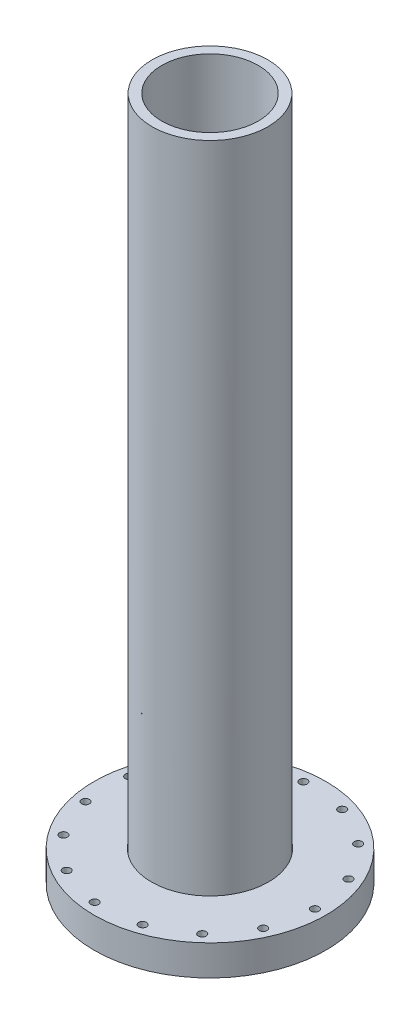
ISO-10303-21;
HEADER;
FILE_DESCRIPTION(('STEP AP214'),'2;1');
FILE_NAME('part.step','',(''),(''),'','','');
FILE_SCHEMA(('AUTOMOTIVE_DESIGN { 1 0 10303 214 1 1 1 1 }'));
ENDSEC;
DATA;
#1=APPLICATION_CONTEXT('core data for automotive mechanical design processes');
#2=APPLICATION_PROTOCOL_DEFINITION('international standard','automotive_design',2000,#1);
#3=PRODUCT_CONTEXT('',#1,'mechanical');
#4=PRODUCT('Part','Part','',(#3));
#5=PRODUCT_RELATED_PRODUCT_CATEGORY('part','',(#4));
#6=PRODUCT_DEFINITION_FORMATION('','',#4);
#7=PRODUCT_DEFINITION_CONTEXT('part definition',#1,'design');
#8=PRODUCT_DEFINITION('design','',#6,#7);
#9=PRODUCT_DEFINITION_SHAPE('','',#8);
#10=(LENGTH_UNIT() NAMED_UNIT(*) SI_UNIT(.MILLI.,.METRE.));
#11=(NAMED_UNIT(*) PLANE_ANGLE_UNIT() SI_UNIT($,.RADIAN.));
#12=(NAMED_UNIT(*) SI_UNIT($,.STERADIAN.) SOLID_ANGLE_UNIT());
#13=UNCERTAINTY_MEASURE_WITH_UNIT(LENGTH_MEASURE(1.E-05),#10,'distance_accuracy_value','');
#14=(GEOMETRIC_REPRESENTATION_CONTEXT(3) GLOBAL_UNCERTAINTY_ASSIGNED_CONTEXT((#13)) GLOBAL_UNIT_ASSIGNED_CONTEXT((#10,
#11,#12)) REPRESENTATION_CONTEXT('',''));
#15=CARTESIAN_POINT('',(0.,0.,0.));
#16=DIRECTION('',(0.,0.,1.));
#17=DIRECTION('',(1.,0.,0.));
#18=AXIS2_PLACEMENT_3D('',#15,#16,#17);
#19=CARTESIAN_POINT('',(0.,20.,0.));
#20=DIRECTION('',(0.,-1.,0.));
#21=DIRECTION('',(0.,0.,-1.));
#22=AXIS2_PLACEMENT_3D('',#19,#20,#21);
#23=CYLINDRICAL_SURFACE('',#22,38.4556);
#24=CARTESIAN_POINT('',(0.,20.,0.));
#25=DIRECTION('',(0.,1.,0.));
#26=DIRECTION('',(0.,0.,1.));
#27=AXIS2_PLACEMENT_3D('',#24,#25,#26);
#28=CIRCLE('',#27,38.4556);
#29=CARTESIAN_POINT('',(0.,20.,38.4556));
#30=VERTEX_POINT('',#29);
#31=EDGE_CURVE('E60',#30,#30,#28,.T.);
#32=ORIENTED_EDGE('',*,*,#31,.T.);
#33=EDGE_LOOP('',(#32));
#34=FACE_BOUND('',#33,.T.);
#35=CARTESIAN_POINT('',(0.,2.,0.));
#36=DIRECTION('',(0.,-1.,0.));
#37=DIRECTION('',(0.,0.,-1.));
#38=AXIS2_PLACEMENT_3D('',#35,#36,#37);
#39=CIRCLE('',#38,38.4556);
#40=CARTESIAN_POINT('',(0.,2.,-38.4556));
#41=VERTEX_POINT('',#40);
#42=EDGE_CURVE('E51',#41,#41,#39,.T.);
#43=ORIENTED_EDGE('',*,*,#42,.T.);
#44=EDGE_LOOP('',(#43));
#45=FACE_BOUND('',#44,.T.);
#46=ADVANCED_FACE('F47',(#34,#45),#23,.F.);
#47=CARTESIAN_POINT('',(0.,20.,0.));
#48=DIRECTION('',(0.,1.,0.));
#49=DIRECTION('',(0.,0.,1.));
#50=AXIS2_PLACEMENT_3D('',#47,#48,#49);
#51=PLANE('',#50);
#52=CARTESIAN_POINT('',(63.0346365773398,20.,-28.0648283722294));
#53=DIRECTION('',(0.,-1.,0.));
#54=DIRECTION('',(0.,0.,-1.));
#55=AXIS2_PLACEMENT_3D('',#52,#53,#54);
#56=CIRCLE('',#55,2.57975099999994);
#57=CARTESIAN_POINT('',(63.0346365773398,20.,-30.6445793722294));
#58=VERTEX_POINT('',#57);
#59=EDGE_CURVE('E148',#58,#58,#56,.T.);
#60=ORIENTED_EDGE('',*,*,#59,.T.);
#61=EDGE_LOOP('',(#60));
#62=FACE_BOUND('',#61,.T.);
#63=CARTESIAN_POINT('',(21.3221726118721,20.,-65.6228996243654));
#64=DIRECTION('',(0.,-1.,0.));
#65=DIRECTION('',(0.,0.,-1.));
#66=AXIS2_PLACEMENT_3D('',#63,#64,#65);
#67=CIRCLE('',#66,2.57975099999994);
#68=CARTESIAN_POINT('',(21.3221726118721,20.,-68.2026506243653));
#69=VERTEX_POINT('',#68);
#70=EDGE_CURVE('E136',#69,#69,#67,.T.);
#71=ORIENTED_EDGE('',*,*,#70,.T.);
#72=EDGE_LOOP('',(#71));
#73=FACE_BOUND('',#72,.T.);
#74=CARTESIAN_POINT('',(-34.4999999999994,20.,-59.7557528611266));
#75=DIRECTION('',(0.,-1.,0.));
#76=DIRECTION('',(0.,0.,-1.));
#77=AXIS2_PLACEMENT_3D('',#74,#75,#76);
#78=CIRCLE('',#77,2.57975099999994);
#79=CARTESIAN_POINT('',(-34.4999999999994,20.,-62.3355038611265));
#80=VERTEX_POINT('',#79);
#81=EDGE_CURVE('E124',#80,#80,#78,.T.);
#82=ORIENTED_EDGE('',*,*,#81,.T.);
#83=EDGE_LOOP('',(#82));
#84=FACE_BOUND('',#83,.T.);
#85=ORIENTED_EDGE('',*,*,#31,.F.);
#86=EDGE_LOOP('',(#85));
#87=FACE_BOUND('',#86,.T.);
#88=CARTESIAN_POINT('',(0.,20.,0.));
#89=DIRECTION('',(0.,1.,0.));
#90=DIRECTION('',(0.,0.,1.));
#91=AXIS2_PLACEMENT_3D('',#88,#89,#90);
#92=CIRCLE('',#91,76.2);
#93=CARTESIAN_POINT('',(0.,20.,76.2));
#94=VERTEX_POINT('',#93);
#95=EDGE_CURVE('E11',#94,#94,#92,.T.);
#96=ORIENTED_EDGE('',*,*,#95,.T.);
#97=EDGE_LOOP('',(#96));
#98=FACE_BOUND('',#97,.T.);
#99=CARTESIAN_POINT('',(69.,20.,0.));
#100=DIRECTION('',(0.,1.,0.));
#101=DIRECTION('',(0.,0.,1.));
#102=AXIS2_PLACEMENT_3D('',#99,#100,#101);
#103=CIRCLE('',#102,2.57975099999996);
#104=CARTESIAN_POINT('',(69.,20.,2.57975099999996));
#105=VERTEX_POINT('',#104);
#106=EDGE_CURVE('E64',#105,#105,#103,.T.);
#107=ORIENTED_EDGE('',*,*,#106,.F.);
#108=EDGE_LOOP('',(#107));
#109=FACE_BOUND('',#108,.T.);
#110=CARTESIAN_POINT('',(63.0346365773394,20.,28.0648283722303));
#111=DIRECTION('',(0.,-1.,0.));
#112=DIRECTION('',(0.,0.,-1.));
#113=AXIS2_PLACEMENT_3D('',#110,#111,#112);
#114=CIRCLE('',#113,2.57975099999994);
#115=CARTESIAN_POINT('',(63.0346365773394,20.,25.4850773722303));
#116=VERTEX_POINT('',#115);
#117=EDGE_CURVE('E70',#116,#116,#114,.T.);
#118=ORIENTED_EDGE('',*,*,#117,.T.);
#119=EDGE_LOOP('',(#118));
#120=FACE_BOUND('',#119,.T.);
#121=CARTESIAN_POINT('',(46.1700118387611,20.,51.2769929579403));
#122=DIRECTION('',(0.,-1.,0.));
#123=DIRECTION('',(0.,0.,-1.));
#124=AXIS2_PLACEMENT_3D('',#121,#122,#123);
#125=CIRCLE('',#124,2.57975099999994);
#126=CARTESIAN_POINT('',(46.1700118387611,20.,48.6972419579403));
#127=VERTEX_POINT('',#126);
#128=EDGE_CURVE('E76',#127,#127,#125,.T.);
#129=ORIENTED_EDGE('',*,*,#128,.T.);
#130=EDGE_LOOP('',(#129));
#131=FACE_BOUND('',#130,.T.);
#132=CARTESIAN_POINT('',(21.3221726118712,20.,65.6228996243657));
#133=DIRECTION('',(0.,-1.,0.));
#134=DIRECTION('',(0.,0.,-1.));
#135=AXIS2_PLACEMENT_3D('',#132,#133,#134);
#136=CIRCLE('',#135,2.57975099999994);
#137=CARTESIAN_POINT('',(21.3221726118712,20.,63.0431486243657));
#138=VERTEX_POINT('',#137);
#139=EDGE_CURVE('E82',#138,#138,#136,.T.);
#140=ORIENTED_EDGE('',*,*,#139,.T.);
#141=EDGE_LOOP('',(#140));
#142=FACE_BOUND('',#141,.T.);
#143=CARTESIAN_POINT('',(-7.21246396546834,20.,68.6220107804108));
#144=DIRECTION('',(0.,-1.,0.));
#145=DIRECTION('',(0.,0.,-1.));
#146=AXIS2_PLACEMENT_3D('',#143,#144,#145);
#147=CIRCLE('',#146,2.57975099999994);
#148=CARTESIAN_POINT('',(-7.21246396546834,20.,66.0422597804109));
#149=VERTEX_POINT('',#148);
#150=EDGE_CURVE('E88',#149,#149,#147,.T.);
#151=ORIENTED_EDGE('',*,*,#150,.T.);
#152=EDGE_LOOP('',(#151));
#153=FACE_BOUND('',#152,.T.);
#154=CARTESIAN_POINT('',(-34.5000000000003,20.,59.7557528611261));
#155=DIRECTION('',(0.,-1.,0.));
#156=DIRECTION('',(0.,0.,-1.));
#157=AXIS2_PLACEMENT_3D('',#154,#155,#156);
#158=CIRCLE('',#157,2.57975099999994);
#159=CARTESIAN_POINT('',(-34.5000000000003,20.,57.1760018611262));
#160=VERTEX_POINT('',#159);
#161=EDGE_CURVE('E94',#160,#160,#158,.T.);
#162=ORIENTED_EDGE('',*,*,#161,.T.);
#163=EDGE_LOOP('',(#162));
#164=FACE_BOUND('',#163,.T.);
#165=CARTESIAN_POINT('',(-55.8221726118716,20.,40.5571824081804));
#166=DIRECTION('',(0.,-1.,0.));
#167=DIRECTION('',(0.,0.,-1.));
#168=AXIS2_PLACEMENT_3D('',#165,#166,#167);
#169=CIRCLE('',#168,2.57975099999994);
#170=CARTESIAN_POINT('',(-55.8221726118716,20.,37.9774314081804));
#171=VERTEX_POINT('',#170);
#172=EDGE_CURVE('E100',#171,#171,#169,.T.);
#173=ORIENTED_EDGE('',*,*,#172,.T.);
#174=EDGE_LOOP('',(#173));
#175=FACE_BOUND('',#174,.T.);
#176=CARTESIAN_POINT('',(-67.4921844506327,20.,14.345906666425));
#177=DIRECTION('',(0.,-1.,0.));
#178=DIRECTION('',(0.,0.,-1.));
#179=AXIS2_PLACEMENT_3D('',#176,#177,#178);
#180=CIRCLE('',#179,2.57975099999994);
#181=CARTESIAN_POINT('',(-67.4921844506327,20.,11.766155666425));
#182=VERTEX_POINT('',#181);
#183=EDGE_CURVE('E106',#182,#182,#180,.T.);
#184=ORIENTED_EDGE('',*,*,#183,.T.);
#185=EDGE_LOOP('',(#184));
#186=FACE_BOUND('',#185,.T.);
#187=CARTESIAN_POINT('',(-67.4921844506325,20.,-14.3459066664259));
#188=DIRECTION('',(0.,-1.,0.));
#189=DIRECTION('',(0.,0.,-1.));
#190=AXIS2_PLACEMENT_3D('',#187,#188,#189);
#191=CIRCLE('',#190,2.57975099999994);
#192=CARTESIAN_POINT('',(-67.4921844506325,20.,-16.9256576664258));
#193=VERTEX_POINT('',#192);
#194=EDGE_CURVE('E112',#193,#193,#191,.T.);
#195=ORIENTED_EDGE('',*,*,#194,.T.);
#196=EDGE_LOOP('',(#195));
#197=FACE_BOUND('',#196,.T.);
#198=CARTESIAN_POINT('',(-55.822172611871,20.,-40.5571824081811));
#199=DIRECTION('',(0.,-1.,0.));
#200=DIRECTION('',(0.,0.,-1.));
#201=AXIS2_PLACEMENT_3D('',#198,#199,#200);
#202=CIRCLE('',#201,2.57975099999994);
#203=CARTESIAN_POINT('',(-55.822172611871,20.,-43.1369334081811));
#204=VERTEX_POINT('',#203);
#205=EDGE_CURVE('E118',#204,#204,#202,.T.);
#206=ORIENTED_EDGE('',*,*,#205,.T.);
#207=EDGE_LOOP('',(#206));
#208=FACE_BOUND('',#207,.T.);
#209=CARTESIAN_POINT('',(-7.21246396546741,20.,-68.6220107804109));
#210=DIRECTION('',(0.,-1.,0.));
#211=DIRECTION('',(0.,0.,-1.));
#212=AXIS2_PLACEMENT_3D('',#209,#210,#211);
#213=CIRCLE('',#212,2.57975099999994);
#214=CARTESIAN_POINT('',(-7.21246396546741,20.,-71.2017617804109));
#215=VERTEX_POINT('',#214);
#216=EDGE_CURVE('E130',#215,#215,#213,.T.);
#217=ORIENTED_EDGE('',*,*,#216,.T.);
#218=EDGE_LOOP('',(#217));
#219=FACE_BOUND('',#218,.T.);
#220=CARTESIAN_POINT('',(46.1700118387618,20.,-51.2769929579397));
#221=DIRECTION('',(0.,-1.,0.));
#222=DIRECTION('',(0.,0.,-1.));
#223=AXIS2_PLACEMENT_3D('',#220,#221,#222);
#224=CIRCLE('',#223,2.57975099999994);
#225=CARTESIAN_POINT('',(46.1700118387618,20.,-53.8567439579396));
#226=VERTEX_POINT('',#225);
#227=EDGE_CURVE('E142',#226,#226,#224,.T.);
#228=ORIENTED_EDGE('',*,*,#227,.T.);
#229=EDGE_LOOP('',(#228));
#230=FACE_BOUND('',#229,.T.);
#231=ADVANCED_FACE('F176',(#62,#73,#84,#87,#98,#109,#120,#131,#142,#153,#164,#175,#186,#197,
#208,#219,#230),#51,.T.);
#232=CARTESIAN_POINT('',(0.,0.,0.));
#233=DIRECTION('',(0.,1.,0.));
#234=DIRECTION('',(0.,0.,1.));
#235=AXIS2_PLACEMENT_3D('',#232,#233,#234);
#236=PLANE('',#235);
#237=CARTESIAN_POINT('',(0.,0.,0.));
#238=DIRECTION('',(0.,-1.,0.));
#239=DIRECTION('',(0.,0.,-1.));
#240=AXIS2_PLACEMENT_3D('',#237,#238,#239);
#241=CIRCLE('',#240,55.14);
#242=CARTESIAN_POINT('',(0.,0.,-55.14));
#243=VERTEX_POINT('',#242);
#244=EDGE_CURVE('E154',#243,#243,#241,.T.);
#245=ORIENTED_EDGE('',*,*,#244,.F.);
#246=EDGE_LOOP('',(#245));
#247=FACE_BOUND('',#246,.T.);
#248=CARTESIAN_POINT('',(63.0346365773398,0.,-28.0648283722294));
#249=DIRECTION('',(0.,-1.,0.));
#250=DIRECTION('',(0.,0.,-1.));
#251=AXIS2_PLACEMENT_3D('',#248,#249,#250);
#252=CIRCLE('',#251,2.57975099999999);
#253=CARTESIAN_POINT('',(63.0346365773398,0.,-30.6445793722294));
#254=VERTEX_POINT('',#253);
#255=EDGE_CURVE('E151',#254,#254,#252,.T.);
#256=ORIENTED_EDGE('',*,*,#255,.F.);
#257=EDGE_LOOP('',(#256));
#258=FACE_BOUND('',#257,.T.);
#259=CARTESIAN_POINT('',(21.3221726118721,0.,-65.6228996243654));
#260=DIRECTION('',(0.,-1.,0.));
#261=DIRECTION('',(0.,0.,-1.));
#262=AXIS2_PLACEMENT_3D('',#259,#260,#261);
#263=CIRCLE('',#262,2.57975099999999);
#264=CARTESIAN_POINT('',(21.3221726118721,0.,-68.2026506243654));
#265=VERTEX_POINT('',#264);
#266=EDGE_CURVE('E139',#265,#265,#263,.T.);
#267=ORIENTED_EDGE('',*,*,#266,.F.);
#268=EDGE_LOOP('',(#267));
#269=FACE_BOUND('',#268,.T.);
#270=CARTESIAN_POINT('',(-34.4999999999994,0.,-59.7557528611266));
#271=DIRECTION('',(0.,-1.,0.));
#272=DIRECTION('',(0.,0.,-1.));
#273=AXIS2_PLACEMENT_3D('',#270,#271,#272);
#274=CIRCLE('',#273,2.57975099999999);
#275=CARTESIAN_POINT('',(-34.4999999999994,0.,-62.3355038611266));
#276=VERTEX_POINT('',#275);
#277=EDGE_CURVE('E127',#276,#276,#274,.T.);
#278=ORIENTED_EDGE('',*,*,#277,.F.);
#279=EDGE_LOOP('',(#278));
#280=FACE_BOUND('',#279,.T.);
#281=CARTESIAN_POINT('',(-55.822172611871,0.,-40.5571824081811));
#282=DIRECTION('',(0.,-1.,0.));
#283=DIRECTION('',(0.,0.,-1.));
#284=AXIS2_PLACEMENT_3D('',#281,#282,#283);
#285=CIRCLE('',#284,2.57975099999999);
#286=CARTESIAN_POINT('',(-55.822172611871,0.,-43.1369334081811));
#287=VERTEX_POINT('',#286);
#288=EDGE_CURVE('E121',#287,#287,#285,.T.);
#289=ORIENTED_EDGE('',*,*,#288,.F.);
#290=EDGE_LOOP('',(#289));
#291=FACE_BOUND('',#290,.T.);
#292=CARTESIAN_POINT('',(-67.4921844506327,0.,14.345906666425));
#293=DIRECTION('',(0.,-1.,0.));
#294=DIRECTION('',(0.,0.,-1.));
#295=AXIS2_PLACEMENT_3D('',#292,#293,#294);
#296=CIRCLE('',#295,2.57975099999999);
#297=CARTESIAN_POINT('',(-67.4921844506327,0.,11.766155666425));
#298=VERTEX_POINT('',#297);
#299=EDGE_CURVE('E109',#298,#298,#296,.T.);
#300=ORIENTED_EDGE('',*,*,#299,.F.);
#301=EDGE_LOOP('',(#300));
#302=FACE_BOUND('',#301,.T.);
#303=CARTESIAN_POINT('',(-55.8221726118716,0.,40.5571824081804));
#304=DIRECTION('',(0.,-1.,0.));
#305=DIRECTION('',(0.,0.,-1.));
#306=AXIS2_PLACEMENT_3D('',#303,#304,#305);
#307=CIRCLE('',#306,2.57975099999999);
#308=CARTESIAN_POINT('',(-55.8221726118716,0.,37.9774314081804));
#309=VERTEX_POINT('',#308);
#310=EDGE_CURVE('E103',#309,#309,#307,.T.);
#311=ORIENTED_EDGE('',*,*,#310,.F.);
#312=EDGE_LOOP('',(#311));
#313=FACE_BOUND('',#312,.T.);
#314=CARTESIAN_POINT('',(-34.5000000000003,0.,59.7557528611261));
#315=DIRECTION('',(0.,-1.,0.));
#316=DIRECTION('',(0.,0.,-1.));
#317=AXIS2_PLACEMENT_3D('',#314,#315,#316);
#318=CIRCLE('',#317,2.57975099999998);
#319=CARTESIAN_POINT('',(-34.5000000000003,0.,57.1760018611261));
#320=VERTEX_POINT('',#319);
#321=EDGE_CURVE('E97',#320,#320,#318,.T.);
#322=ORIENTED_EDGE('',*,*,#321,.F.);
#323=EDGE_LOOP('',(#322));
#324=FACE_BOUND('',#323,.T.);
#325=CARTESIAN_POINT('',(21.3221726118712,0.,65.6228996243657));
#326=DIRECTION('',(0.,-1.,0.));
#327=DIRECTION('',(0.,0.,-1.));
#328=AXIS2_PLACEMENT_3D('',#325,#326,#327);
#329=CIRCLE('',#328,2.57975099999999);
#330=CARTESIAN_POINT('',(21.3221726118712,0.,63.0431486243657));
#331=VERTEX_POINT('',#330);
#332=EDGE_CURVE('E85',#331,#331,#329,.T.);
#333=ORIENTED_EDGE('',*,*,#332,.F.);
#334=EDGE_LOOP('',(#333));
#335=FACE_BOUND('',#334,.T.);
#336=CARTESIAN_POINT('',(46.1700118387611,0.,51.2769929579403));
#337=DIRECTION('',(0.,-1.,0.));
#338=DIRECTION('',(0.,0.,-1.));
#339=AXIS2_PLACEMENT_3D('',#336,#337,#338);
#340=CIRCLE('',#339,2.57975099999999);
#341=CARTESIAN_POINT('',(46.1700118387611,0.,48.6972419579403));
#342=VERTEX_POINT('',#341);
#343=EDGE_CURVE('E79',#342,#342,#340,.T.);
#344=ORIENTED_EDGE('',*,*,#343,.F.);
#345=EDGE_LOOP('',(#344));
#346=FACE_BOUND('',#345,.T.);
#347=CARTESIAN_POINT('',(63.0346365773394,0.,28.0648283722303));
#348=DIRECTION('',(0.,-1.,0.));
#349=DIRECTION('',(0.,0.,-1.));
#350=AXIS2_PLACEMENT_3D('',#347,#348,#349);
#351=CIRCLE('',#350,2.57975099999999);
#352=CARTESIAN_POINT('',(63.0346365773394,0.,25.4850773722303));
#353=VERTEX_POINT('',#352);
#354=EDGE_CURVE('E73',#353,#353,#351,.T.);
#355=ORIENTED_EDGE('',*,*,#354,.F.);
#356=EDGE_LOOP('',(#355));
#357=FACE_BOUND('',#356,.T.);
#358=CARTESIAN_POINT('',(69.,0.,0.));
#359=DIRECTION('',(0.,-1.,0.));
#360=DIRECTION('',(0.,0.,-1.));
#361=AXIS2_PLACEMENT_3D('',#358,#359,#360);
#362=CIRCLE('',#361,2.57975099999999);
#363=CARTESIAN_POINT('',(69.,0.,-2.57975099999999));
#364=VERTEX_POINT('',#363);
#365=EDGE_CURVE('E67',#364,#364,#362,.T.);
#366=ORIENTED_EDGE('',*,*,#365,.F.);
#367=EDGE_LOOP('',(#366));
#368=FACE_BOUND('',#367,.T.);
#369=CARTESIAN_POINT('',(0.,0.,0.));
#370=DIRECTION('',(0.,1.,0.));
#371=DIRECTION('',(0.,0.,1.));
#372=AXIS2_PLACEMENT_3D('',#369,#370,#371);
#373=CIRCLE('',#372,76.2);
#374=CARTESIAN_POINT('',(0.,0.,76.2));
#375=VERTEX_POINT('',#374);
#376=EDGE_CURVE('E55',#375,#375,#373,.T.);
#377=ORIENTED_EDGE('',*,*,#376,.F.);
#378=EDGE_LOOP('',(#377));
#379=FACE_BOUND('',#378,.T.);
#380=CARTESIAN_POINT('',(-7.21246396546834,0.,68.6220107804108));
#381=DIRECTION('',(0.,-1.,0.));
#382=DIRECTION('',(0.,0.,-1.));
#383=AXIS2_PLACEMENT_3D('',#380,#381,#382);
#384=CIRCLE('',#383,2.57975099999999);
#385=CARTESIAN_POINT('',(-7.21246396546834,0.,66.0422597804109));
#386=VERTEX_POINT('',#385);
#387=EDGE_CURVE('E91',#386,#386,#384,.T.);
#388=ORIENTED_EDGE('',*,*,#387,.F.);
#389=EDGE_LOOP('',(#388));
#390=FACE_BOUND('',#389,.T.);
#391=CARTESIAN_POINT('',(-67.4921844506325,0.,-14.3459066664259));
#392=DIRECTION('',(0.,-1.,0.));
#393=DIRECTION('',(0.,0.,-1.));
#394=AXIS2_PLACEMENT_3D('',#391,#392,#393);
#395=CIRCLE('',#394,2.57975099999999);
#396=CARTESIAN_POINT('',(-67.4921844506325,0.,-16.9256576664259));
#397=VERTEX_POINT('',#396);
#398=EDGE_CURVE('E115',#397,#397,#395,.T.);
#399=ORIENTED_EDGE('',*,*,#398,.F.);
#400=EDGE_LOOP('',(#399));
#401=FACE_BOUND('',#400,.T.);
#402=CARTESIAN_POINT('',(-7.21246396546741,0.,-68.6220107804109));
#403=DIRECTION('',(0.,-1.,0.));
#404=DIRECTION('',(0.,0.,-1.));
#405=AXIS2_PLACEMENT_3D('',#402,#403,#404);
#406=CIRCLE('',#405,2.57975099999999);
#407=CARTESIAN_POINT('',(-7.21246396546741,0.,-71.2017617804109));
#408=VERTEX_POINT('',#407);
#409=EDGE_CURVE('E133',#408,#408,#406,.T.);
#410=ORIENTED_EDGE('',*,*,#409,.F.);
#411=EDGE_LOOP('',(#410));
#412=FACE_BOUND('',#411,.T.);
#413=CARTESIAN_POINT('',(46.1700118387618,0.,-51.2769929579397));
#414=DIRECTION('',(0.,-1.,0.));
#415=DIRECTION('',(0.,0.,-1.));
#416=AXIS2_PLACEMENT_3D('',#413,#414,#415);
#417=CIRCLE('',#416,2.57975099999999);
#418=CARTESIAN_POINT('',(46.1700118387618,0.,-53.8567439579396));
#419=VERTEX_POINT('',#418);
#420=EDGE_CURVE('E145',#419,#419,#417,.T.);
#421=ORIENTED_EDGE('',*,*,#420,.F.);
#422=EDGE_LOOP('',(#421));
#423=FACE_BOUND('',#422,.T.);
#424=ADVANCED_FACE('F182',(#247,#258,#269,#280,#291,#302,#313,#324,#335,#346,#357,#368,#379,
#390,#401,#412,#423),#236,.F.);
#425=CARTESIAN_POINT('',(0.,20.,0.));
#426=DIRECTION('',(0.,-1.,0.));
#427=DIRECTION('',(0.,0.,-1.));
#428=AXIS2_PLACEMENT_3D('',#425,#426,#427);
#429=CYLINDRICAL_SURFACE('',#428,76.2);
#430=ORIENTED_EDGE('',*,*,#95,.F.);
#431=EDGE_LOOP('',(#430));
#432=FACE_BOUND('',#431,.T.);
#433=ORIENTED_EDGE('',*,*,#376,.T.);
#434=EDGE_LOOP('',(#433));
#435=FACE_BOUND('',#434,.T.);
#436=ADVANCED_FACE('F49',(#432,#435),#429,.T.);
#437=CARTESIAN_POINT('',(69.,0.,0.));
#438=DIRECTION('',(0.,-1.,0.));
#439=DIRECTION('',(0.,0.,-1.));
#440=AXIS2_PLACEMENT_3D('',#437,#438,#439);
#441=CYLINDRICAL_SURFACE('',#440,2.57975099999996);
#442=ORIENTED_EDGE('',*,*,#106,.T.);
#443=EDGE_LOOP('',(#442));
#444=FACE_BOUND('',#443,.T.);
#445=ORIENTED_EDGE('',*,*,#365,.T.);
#446=EDGE_LOOP('',(#445));
#447=FACE_BOUND('',#446,.T.);
#448=ADVANCED_FACE('F186',(#444,#447),#441,.F.);
#449=CARTESIAN_POINT('',(63.0346365773394,0.,28.0648283722303));
#450=DIRECTION('',(0.,-1.,0.));
#451=DIRECTION('',(0.,0.,-1.));
#452=AXIS2_PLACEMENT_3D('',#449,#450,#451);
#453=CYLINDRICAL_SURFACE('',#452,2.57975099999996);
#454=ORIENTED_EDGE('',*,*,#117,.F.);
#455=EDGE_LOOP('',(#454));
#456=FACE_BOUND('',#455,.T.);
#457=ORIENTED_EDGE('',*,*,#354,.T.);
#458=EDGE_LOOP('',(#457));
#459=FACE_BOUND('',#458,.T.);
#460=ADVANCED_FACE('F281',(#456,#459),#453,.F.);
#461=CARTESIAN_POINT('',(46.1700118387611,0.,51.2769929579403));
#462=DIRECTION('',(0.,-1.,0.));
#463=DIRECTION('',(0.,0.,-1.));
#464=AXIS2_PLACEMENT_3D('',#461,#462,#463);
#465=CYLINDRICAL_SURFACE('',#464,2.57975099999997);
#466=ORIENTED_EDGE('',*,*,#128,.F.);
#467=EDGE_LOOP('',(#466));
#468=FACE_BOUND('',#467,.T.);
#469=ORIENTED_EDGE('',*,*,#343,.T.);
#470=EDGE_LOOP('',(#469));
#471=FACE_BOUND('',#470,.T.);
#472=ADVANCED_FACE('F278',(#468,#471),#465,.F.);
#473=CARTESIAN_POINT('',(21.3221726118712,0.,65.6228996243657));
#474=DIRECTION('',(0.,-1.,0.));
#475=DIRECTION('',(0.,0.,-1.));
#476=AXIS2_PLACEMENT_3D('',#473,#474,#475);
#477=CYLINDRICAL_SURFACE('',#476,2.57975099999997);
#478=ORIENTED_EDGE('',*,*,#139,.F.);
#479=EDGE_LOOP('',(#478));
#480=FACE_BOUND('',#479,.T.);
#481=ORIENTED_EDGE('',*,*,#332,.T.);
#482=EDGE_LOOP('',(#481));
#483=FACE_BOUND('',#482,.T.);
#484=ADVANCED_FACE('F274',(#480,#483),#477,.F.);
#485=CARTESIAN_POINT('',(-7.21246396546834,0.,68.6220107804108));
#486=DIRECTION('',(0.,-1.,0.));
#487=DIRECTION('',(0.,0.,-1.));
#488=AXIS2_PLACEMENT_3D('',#485,#486,#487);
#489=CYLINDRICAL_SURFACE('',#488,2.57975099999996);
#490=ORIENTED_EDGE('',*,*,#150,.F.);
#491=EDGE_LOOP('',(#490));
#492=FACE_BOUND('',#491,.T.);
#493=ORIENTED_EDGE('',*,*,#387,.T.);
#494=EDGE_LOOP('',(#493));
#495=FACE_BOUND('',#494,.T.);
#496=ADVANCED_FACE('F270',(#492,#495),#489,.F.);
#497=CARTESIAN_POINT('',(-34.5000000000003,0.,59.7557528611261));
#498=DIRECTION('',(0.,-1.,0.));
#499=DIRECTION('',(0.,0.,-1.));
#500=AXIS2_PLACEMENT_3D('',#497,#498,#499);
#501=CYLINDRICAL_SURFACE('',#500,2.57975099999996);
#502=ORIENTED_EDGE('',*,*,#161,.F.);
#503=EDGE_LOOP('',(#502));
#504=FACE_BOUND('',#503,.T.);
#505=ORIENTED_EDGE('',*,*,#321,.T.);
#506=EDGE_LOOP('',(#505));
#507=FACE_BOUND('',#506,.T.);
#508=ADVANCED_FACE('F266',(#504,#507),#501,.F.);
#509=CARTESIAN_POINT('',(-55.8221726118716,0.,40.5571824081804));
#510=DIRECTION('',(0.,-1.,0.));
#511=DIRECTION('',(0.,0.,-1.));
#512=AXIS2_PLACEMENT_3D('',#509,#510,#511);
#513=CYLINDRICAL_SURFACE('',#512,2.57975099999997);
#514=ORIENTED_EDGE('',*,*,#172,.F.);
#515=EDGE_LOOP('',(#514));
#516=FACE_BOUND('',#515,.T.);
#517=ORIENTED_EDGE('',*,*,#310,.T.);
#518=EDGE_LOOP('',(#517));
#519=FACE_BOUND('',#518,.T.);
#520=ADVANCED_FACE('F262',(#516,#519),#513,.F.);
#521=CARTESIAN_POINT('',(-67.4921844506327,0.,14.345906666425));
#522=DIRECTION('',(0.,-1.,0.));
#523=DIRECTION('',(0.,0.,-1.));
#524=AXIS2_PLACEMENT_3D('',#521,#522,#523);
#525=CYLINDRICAL_SURFACE('',#524,2.57975099999996);
#526=ORIENTED_EDGE('',*,*,#183,.F.);
#527=EDGE_LOOP('',(#526));
#528=FACE_BOUND('',#527,.T.);
#529=ORIENTED_EDGE('',*,*,#299,.T.);
#530=EDGE_LOOP('',(#529));
#531=FACE_BOUND('',#530,.T.);
#532=ADVANCED_FACE('F258',(#528,#531),#525,.F.);
#533=CARTESIAN_POINT('',(-67.4921844506325,0.,-14.3459066664259));
#534=DIRECTION('',(0.,-1.,0.));
#535=DIRECTION('',(0.,0.,-1.));
#536=AXIS2_PLACEMENT_3D('',#533,#534,#535);
#537=CYLINDRICAL_SURFACE('',#536,2.57975099999996);
#538=ORIENTED_EDGE('',*,*,#194,.F.);
#539=EDGE_LOOP('',(#538));
#540=FACE_BOUND('',#539,.T.);
#541=ORIENTED_EDGE('',*,*,#398,.T.);
#542=EDGE_LOOP('',(#541));
#543=FACE_BOUND('',#542,.T.);
#544=ADVANCED_FACE('F254',(#540,#543),#537,.F.);
#545=CARTESIAN_POINT('',(-55.822172611871,0.,-40.5571824081811));
#546=DIRECTION('',(0.,-1.,0.));
#547=DIRECTION('',(0.,0.,-1.));
#548=AXIS2_PLACEMENT_3D('',#545,#546,#547);
#549=CYLINDRICAL_SURFACE('',#548,2.57975099999997);
#550=ORIENTED_EDGE('',*,*,#205,.F.);
#551=EDGE_LOOP('',(#550));
#552=FACE_BOUND('',#551,.T.);
#553=ORIENTED_EDGE('',*,*,#288,.T.);
#554=EDGE_LOOP('',(#553));
#555=FACE_BOUND('',#554,.T.);
#556=ADVANCED_FACE('F250',(#552,#555),#549,.F.);
#557=CARTESIAN_POINT('',(-34.4999999999994,0.,-59.7557528611266));
#558=DIRECTION('',(0.,-1.,0.));
#559=DIRECTION('',(0.,0.,-1.));
#560=AXIS2_PLACEMENT_3D('',#557,#558,#559);
#561=CYLINDRICAL_SURFACE('',#560,2.57975099999997);
#562=ORIENTED_EDGE('',*,*,#81,.F.);
#563=EDGE_LOOP('',(#562));
#564=FACE_BOUND('',#563,.T.);
#565=ORIENTED_EDGE('',*,*,#277,.T.);
#566=EDGE_LOOP('',(#565));
#567=FACE_BOUND('',#566,.T.);
#568=ADVANCED_FACE('F246',(#564,#567),#561,.F.);
#569=CARTESIAN_POINT('',(-7.21246396546741,0.,-68.6220107804109));
#570=DIRECTION('',(0.,-1.,0.));
#571=DIRECTION('',(0.,0.,-1.));
#572=AXIS2_PLACEMENT_3D('',#569,#570,#571);
#573=CYLINDRICAL_SURFACE('',#572,2.57975099999996);
#574=ORIENTED_EDGE('',*,*,#216,.F.);
#575=EDGE_LOOP('',(#574));
#576=FACE_BOUND('',#575,.T.);
#577=ORIENTED_EDGE('',*,*,#409,.T.);
#578=EDGE_LOOP('',(#577));
#579=FACE_BOUND('',#578,.T.);
#580=ADVANCED_FACE('F239',(#576,#579),#573,.F.);
#581=CARTESIAN_POINT('',(21.3221726118721,0.,-65.6228996243654));
#582=DIRECTION('',(0.,-1.,0.));
#583=DIRECTION('',(0.,0.,-1.));
#584=AXIS2_PLACEMENT_3D('',#581,#582,#583);
#585=CYLINDRICAL_SURFACE('',#584,2.57975099999997);
#586=ORIENTED_EDGE('',*,*,#70,.F.);
#587=EDGE_LOOP('',(#586));
#588=FACE_BOUND('',#587,.T.);
#589=ORIENTED_EDGE('',*,*,#266,.T.);
#590=EDGE_LOOP('',(#589));
#591=FACE_BOUND('',#590,.T.);
#592=ADVANCED_FACE('F230',(#588,#591),#585,.F.);
#593=CARTESIAN_POINT('',(46.1700118387618,0.,-51.2769929579397));
#594=DIRECTION('',(0.,-1.,0.));
#595=DIRECTION('',(0.,0.,-1.));
#596=AXIS2_PLACEMENT_3D('',#593,#594,#595);
#597=CYLINDRICAL_SURFACE('',#596,2.57975099999997);
#598=ORIENTED_EDGE('',*,*,#227,.F.);
#599=EDGE_LOOP('',(#598));
#600=FACE_BOUND('',#599,.T.);
#601=ORIENTED_EDGE('',*,*,#420,.T.);
#602=EDGE_LOOP('',(#601));
#603=FACE_BOUND('',#602,.T.);
#604=ADVANCED_FACE('F228',(#600,#603),#597,.F.);
#605=CARTESIAN_POINT('',(63.0346365773398,0.,-28.0648283722294));
#606=DIRECTION('',(0.,-1.,0.));
#607=DIRECTION('',(0.,0.,-1.));
#608=AXIS2_PLACEMENT_3D('',#605,#606,#607);
#609=CYLINDRICAL_SURFACE('',#608,2.57975099999996);
#610=ORIENTED_EDGE('',*,*,#59,.F.);
#611=EDGE_LOOP('',(#610));
#612=FACE_BOUND('',#611,.T.);
#613=ORIENTED_EDGE('',*,*,#255,.T.);
#614=EDGE_LOOP('',(#613));
#615=FACE_BOUND('',#614,.T.);
#616=ADVANCED_FACE('F172',(#612,#615),#609,.F.);
#617=CARTESIAN_POINT('',(0.,2.,0.));
#618=DIRECTION('',(0.,-1.,0.));
#619=DIRECTION('',(0.,0.,-1.));
#620=AXIS2_PLACEMENT_3D('',#617,#618,#619);
#621=CYLINDRICAL_SURFACE('',#620,55.14);
#622=CARTESIAN_POINT('',(0.,2.,0.));
#623=DIRECTION('',(0.,-1.,0.));
#624=DIRECTION('',(0.,0.,-1.));
#625=AXIS2_PLACEMENT_3D('',#622,#623,#624);
#626=CIRCLE('',#625,55.14);
#627=CARTESIAN_POINT('',(0.,2.,-55.14));
#628=VERTEX_POINT('',#627);
#629=EDGE_CURVE('E157',#628,#628,#626,.T.);
#630=ORIENTED_EDGE('',*,*,#629,.F.);
#631=EDGE_LOOP('',(#630));
#632=FACE_BOUND('',#631,.T.);
#633=ORIENTED_EDGE('',*,*,#244,.T.);
#634=EDGE_LOOP('',(#633));
#635=FACE_BOUND('',#634,.T.);
#636=ADVANCED_FACE('F167',(#632,#635),#621,.F.);
#637=CARTESIAN_POINT('',(0.,2.,0.));
#638=DIRECTION('',(0.,-1.,0.));
#639=DIRECTION('',(0.,0.,-1.));
#640=AXIS2_PLACEMENT_3D('',#637,#638,#639);
#641=PLANE('',#640);
#642=ORIENTED_EDGE('',*,*,#42,.F.);
#643=EDGE_LOOP('',(#642));
#644=FACE_BOUND('',#643,.T.);
#645=ORIENTED_EDGE('',*,*,#629,.T.);
#646=EDGE_LOOP('',(#645));
#647=FACE_BOUND('',#646,.T.);
#648=ADVANCED_FACE('F165',(#644,#647),#641,.T.);
#649=CLOSED_SHELL('',(#46,#231,#424,#436,#448,#460,#472,#484,#496,#508,#520,#532,#544,#556,#568,
#580,#592,#604,#616,#636,#648));
#650=MANIFOLD_SOLID_BREP('B2',#649);
#651=CARTESIAN_POINT('',(0.,450.,0.));
#652=DIRECTION('',(0.,-1.,0.));
#653=DIRECTION('',(0.,0.,-1.));
#654=AXIS2_PLACEMENT_3D('',#651,#652,#653);
#655=CYLINDRICAL_SURFACE('',#654,38.1);
#656=CARTESIAN_POINT('',(0.,450.,0.));
#657=DIRECTION('',(0.,1.,0.));
#658=DIRECTION('',(0.,0.,1.));
#659=AXIS2_PLACEMENT_3D('',#656,#657,#658);
#660=CIRCLE('',#659,38.1);
#661=CARTESIAN_POINT('',(0.,450.,38.1));
#662=VERTEX_POINT('',#661);
#663=EDGE_CURVE('E46',#662,#662,#660,.T.);
#664=ORIENTED_EDGE('',*,*,#663,.F.);
#665=EDGE_LOOP('',(#664));
#666=FACE_BOUND('',#665,.T.);
#667=CARTESIAN_POINT('',(0.,2.,0.));
#668=DIRECTION('',(0.,-1.,0.));
#669=DIRECTION('',(0.,0.,-1.));
#670=AXIS2_PLACEMENT_3D('',#667,#668,#669);
#671=CIRCLE('',#670,38.1);
#672=CARTESIAN_POINT('',(0.,2.,-38.1));
#673=VERTEX_POINT('',#672);
#674=EDGE_CURVE('E467',#673,#673,#671,.T.);
#675=ORIENTED_EDGE('',*,*,#674,.F.);
#676=EDGE_LOOP('',(#675));
#677=FACE_BOUND('',#676,.T.);
#678=ADVANCED_FACE('F454',(#666,#677),#655,.T.);
#679=CARTESIAN_POINT('',(0.,450.,0.));
#680=DIRECTION('',(0.,-1.,0.));
#681=DIRECTION('',(0.,0.,-1.));
#682=AXIS2_PLACEMENT_3D('',#679,#680,#681);
#683=CYLINDRICAL_SURFACE('',#682,31.75);
#684=CARTESIAN_POINT('',(0.,450.,0.));
#685=DIRECTION('',(0.,1.,0.));
#686=DIRECTION('',(0.,0.,1.));
#687=AXIS2_PLACEMENT_3D('',#684,#685,#686);
#688=CIRCLE('',#687,31.75);
#689=CARTESIAN_POINT('',(0.,450.,31.75));
#690=VERTEX_POINT('',#689);
#691=EDGE_CURVE('E462',#690,#690,#688,.T.);
#692=ORIENTED_EDGE('',*,*,#691,.T.);
#693=EDGE_LOOP('',(#692));
#694=FACE_BOUND('',#693,.T.);
#695=CARTESIAN_POINT('',(0.,2.,0.));
#696=DIRECTION('',(0.,-1.,0.));
#697=DIRECTION('',(0.,0.,-1.));
#698=AXIS2_PLACEMENT_3D('',#695,#696,#697);
#699=CIRCLE('',#698,31.75);
#700=CARTESIAN_POINT('',(0.,2.,-31.75));
#701=VERTEX_POINT('',#700);
#702=EDGE_CURVE('E457',#701,#701,#699,.T.);
#703=ORIENTED_EDGE('',*,*,#702,.T.);
#704=EDGE_LOOP('',(#703));
#705=FACE_BOUND('',#704,.T.);
#706=ADVANCED_FACE('F478',(#694,#705),#683,.F.);
#707=CARTESIAN_POINT('',(0.,450.,0.));
#708=DIRECTION('',(0.,1.,0.));
#709=DIRECTION('',(0.,0.,1.));
#710=AXIS2_PLACEMENT_3D('',#707,#708,#709);
#711=PLANE('',#710);
#712=ORIENTED_EDGE('',*,*,#663,.T.);
#713=EDGE_LOOP('',(#712));
#714=FACE_BOUND('',#713,.T.);
#715=ORIENTED_EDGE('',*,*,#691,.F.);
#716=EDGE_LOOP('',(#715));
#717=FACE_BOUND('',#716,.T.);
#718=ADVANCED_FACE('F482',(#714,#717),#711,.T.);
#719=CARTESIAN_POINT('',(0.,2.,0.));
#720=DIRECTION('',(0.,-1.,0.));
#721=DIRECTION('',(0.,0.,-1.));
#722=AXIS2_PLACEMENT_3D('',#719,#720,#721);
#723=PLANE('',#722);
#724=ORIENTED_EDGE('',*,*,#702,.F.);
#725=EDGE_LOOP('',(#724));
#726=FACE_BOUND('',#725,.T.);
#727=ORIENTED_EDGE('',*,*,#674,.T.);
#728=EDGE_LOOP('',(#727));
#729=FACE_BOUND('',#728,.T.);
#730=ADVANCED_FACE('F480',(#726,#729),#723,.T.);
#731=CLOSED_SHELL('',(#678,#706,#718,#730));
#732=MANIFOLD_SOLID_BREP('B6',#731);
#733=ADVANCED_BREP_SHAPE_REPRESENTATION('',(#18,#650,#732),#14);
#734=SHAPE_DEFINITION_REPRESENTATION(#9,#733);
ENDSEC;
END-ISO-10303-21;
